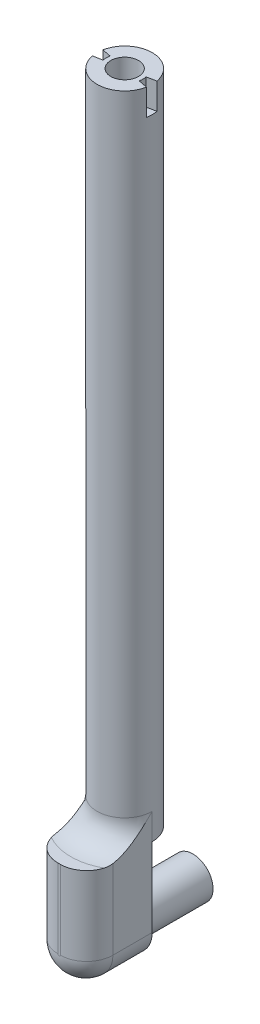
ISO-10303-21;
HEADER;
FILE_DESCRIPTION(('STEP AP214'),'2;1');
FILE_NAME('part.step','',(''),(''),'','','');
FILE_SCHEMA(('AUTOMOTIVE_DESIGN { 1 0 10303 214 1 1 1 1 }'));
ENDSEC;
DATA;
#1=APPLICATION_CONTEXT('core data for automotive mechanical design processes');
#2=APPLICATION_PROTOCOL_DEFINITION('international standard','automotive_design',2000,#1);
#3=PRODUCT_CONTEXT('',#1,'mechanical');
#4=PRODUCT('Part','Part','',(#3));
#5=PRODUCT_RELATED_PRODUCT_CATEGORY('part','',(#4));
#6=PRODUCT_DEFINITION_FORMATION('','',#4);
#7=PRODUCT_DEFINITION_CONTEXT('part definition',#1,'design');
#8=PRODUCT_DEFINITION('design','',#6,#7);
#9=PRODUCT_DEFINITION_SHAPE('','',#8);
#10=(LENGTH_UNIT() NAMED_UNIT(*) SI_UNIT(.MILLI.,.METRE.));
#11=(NAMED_UNIT(*) PLANE_ANGLE_UNIT() SI_UNIT($,.RADIAN.));
#12=(NAMED_UNIT(*) SI_UNIT($,.STERADIAN.) SOLID_ANGLE_UNIT());
#13=UNCERTAINTY_MEASURE_WITH_UNIT(LENGTH_MEASURE(1.E-05),#10,'distance_accuracy_value','');
#14=(GEOMETRIC_REPRESENTATION_CONTEXT(3) GLOBAL_UNCERTAINTY_ASSIGNED_CONTEXT((#13)) GLOBAL_UNIT_ASSIGNED_CONTEXT((#10,
#11,#12)) REPRESENTATION_CONTEXT('',''));
#15=CARTESIAN_POINT('',(0.,0.,0.));
#16=DIRECTION('',(0.,0.,1.));
#17=DIRECTION('',(1.,0.,0.));
#18=AXIS2_PLACEMENT_3D('',#15,#16,#17);
#19=CARTESIAN_POINT('',(0.,120.,0.));
#20=DIRECTION('',(0.,1.,0.));
#21=DIRECTION('',(0.,0.,1.));
#22=AXIS2_PLACEMENT_3D('',#19,#20,#21);
#23=PLANE('',#22);
#24=DIRECTION('',(-0.981691815623253,0.,0.19047619047619));
#25=VECTOR('',#24,1.);
#26=CARTESIAN_POINT('',(-3.43592135468138,120.,0.666666666666667));
#27=LINE('',#26,#25);
#28=CARTESIAN_POINT('',(-3.43592135468138,120.,0.666666666666667));
#29=VERTEX_POINT('',#28);
#30=CARTESIAN_POINT('',(-5.15388203202208,120.,1.));
#31=VERTEX_POINT('',#30);
#32=EDGE_CURVE('E63',#29,#31,#27,.T.);
#33=ORIENTED_EDGE('',*,*,#32,.F.);
#34=CARTESIAN_POINT('',(0.,120.,0.));
#35=DIRECTION('',(0.,1.,0.));
#36=DIRECTION('',(0.,0.,1.));
#37=AXIS2_PLACEMENT_3D('',#34,#35,#36);
#38=CIRCLE('',#37,3.5);
#39=CARTESIAN_POINT('',(-3.43592135468138,120.,-0.666666666666666));
#40=VERTEX_POINT('',#39);
#41=EDGE_CURVE('E67',#40,#29,#38,.T.);
#42=ORIENTED_EDGE('',*,*,#41,.F.);
#43=DIRECTION('',(0.981691815623253,0.,0.19047619047619));
#44=VECTOR('',#43,1.);
#45=CARTESIAN_POINT('',(-3.43592135468138,120.,-0.666666666666666));
#46=LINE('',#45,#44);
#47=CARTESIAN_POINT('',(-5.15388203202208,120.,-0.999999999999999));
#48=VERTEX_POINT('',#47);
#49=EDGE_CURVE('E591',#48,#40,#46,.T.);
#50=ORIENTED_EDGE('',*,*,#49,.F.);
#51=CARTESIAN_POINT('',(0.,120.,0.));
#52=DIRECTION('',(0.,1.,0.));
#53=DIRECTION('',(0.,0.,1.));
#54=AXIS2_PLACEMENT_3D('',#51,#52,#53);
#55=CIRCLE('',#54,5.25);
#56=EDGE_CURVE('E219',#48,#31,#55,.T.);
#57=ORIENTED_EDGE('',*,*,#56,.T.);
#58=EDGE_LOOP('',(#33,#42,#50,#57));
#59=FACE_BOUND('',#58,.T.);
#60=ADVANCED_FACE('F45',(#59),#23,.T.);
#61=CARTESIAN_POINT('',(0.,120.,0.));
#62=DIRECTION('',(0.,-1.,0.));
#63=DIRECTION('',(0.,0.,-1.));
#64=AXIS2_PLACEMENT_3D('',#61,#62,#63);
#65=CYLINDRICAL_SURFACE('',#64,5.25);
#66=CARTESIAN_POINT('',(5.15388203202208,120.,1.));
#67=VERTEX_POINT('',#66);
#68=CARTESIAN_POINT('',(5.15388203202208,120.,-1.));
#69=VERTEX_POINT('',#68);
#70=EDGE_CURVE('E216',#67,#69,#55,.T.);
#71=ORIENTED_EDGE('',*,*,#70,.F.);
#72=DIRECTION('',(0.,-1.,0.));
#73=VECTOR('',#72,1.);
#74=CARTESIAN_POINT('',(5.15388203202208,125.,0.999999999999999));
#75=LINE('',#74,#73);
#76=CARTESIAN_POINT('',(5.15388203202208,125.,0.999999999999999));
#77=VERTEX_POINT('',#76);
#78=EDGE_CURVE('E571',#77,#67,#75,.T.);
#79=ORIENTED_EDGE('',*,*,#78,.F.);
#80=CARTESIAN_POINT('',(0.,125.,0.));
#81=DIRECTION('',(0.,1.,0.));
#82=DIRECTION('',(0.,0.,1.));
#83=AXIS2_PLACEMENT_3D('',#80,#81,#82);
#84=CIRCLE('',#83,5.25000000000001);
#85=CARTESIAN_POINT('',(-5.15388203202208,125.,1.));
#86=VERTEX_POINT('',#85);
#87=EDGE_CURVE('E576',#86,#77,#84,.T.);
#88=ORIENTED_EDGE('',*,*,#87,.F.);
#89=DIRECTION('',(0.,-1.,0.));
#90=VECTOR('',#89,1.);
#91=CARTESIAN_POINT('',(-5.15388203202208,125.,1.));
#92=LINE('',#91,#90);
#93=EDGE_CURVE('E574',#86,#31,#92,.T.);
#94=ORIENTED_EDGE('',*,*,#93,.T.);
#95=ORIENTED_EDGE('',*,*,#56,.F.);
#96=DIRECTION('',(0.,-1.,0.));
#97=VECTOR('',#96,1.);
#98=CARTESIAN_POINT('',(-5.15388203202208,125.,-1.));
#99=LINE('',#98,#97);
#100=CARTESIAN_POINT('',(-5.15388203202208,125.,-1.));
#101=VERTEX_POINT('',#100);
#102=EDGE_CURVE('E189',#101,#48,#99,.T.);
#103=ORIENTED_EDGE('',*,*,#102,.F.);
#104=CARTESIAN_POINT('',(0.,125.,0.));
#105=DIRECTION('',(0.,1.,0.));
#106=DIRECTION('',(0.,0.,-1.));
#107=AXIS2_PLACEMENT_3D('',#104,#105,#106);
#108=CIRCLE('',#107,5.25);
#109=CARTESIAN_POINT('',(5.15388203202208,125.,-1.));
#110=VERTEX_POINT('',#109);
#111=EDGE_CURVE('E169',#110,#101,#108,.T.);
#112=ORIENTED_EDGE('',*,*,#111,.F.);
#113=DIRECTION('',(0.,-1.,0.));
#114=VECTOR('',#113,1.);
#115=CARTESIAN_POINT('',(5.15388203202208,125.,-1.));
#116=LINE('',#115,#114);
#117=EDGE_CURVE('E166',#110,#69,#116,.T.);
#118=ORIENTED_EDGE('',*,*,#117,.T.);
#119=EDGE_LOOP('',(#71,#79,#88,#94,#95,#103,#112,#118));
#120=FACE_BOUND('',#119,.T.);
#121=CARTESIAN_POINT('',(0.,5.,0.));
#122=DIRECTION('',(0.,-1.,0.));
#123=DIRECTION('',(0.,0.,-1.));
#124=AXIS2_PLACEMENT_3D('',#121,#122,#123);
#125=CIRCLE('',#124,5.25);
#126=CARTESIAN_POINT('',(-5.25,5.,0.));
#127=VERTEX_POINT('',#126);
#128=CARTESIAN_POINT('',(5.25,5.,0.));
#129=VERTEX_POINT('',#128);
#130=EDGE_CURVE('E227',#127,#129,#125,.F.);
#131=ORIENTED_EDGE('',*,*,#130,.T.);
#132=DIRECTION('',(0.,-1.,0.));
#133=VECTOR('',#132,1.);
#134=CARTESIAN_POINT('',(5.25,2.5,0.));
#135=LINE('',#134,#133);
#136=CARTESIAN_POINT('',(5.25,0.,0.));
#137=VERTEX_POINT('',#136);
#138=EDGE_CURVE('E230',#129,#137,#135,.T.);
#139=ORIENTED_EDGE('',*,*,#138,.T.);
#140=CARTESIAN_POINT('',(0.,0.,0.));
#141=DIRECTION('',(0.,1.,0.));
#142=DIRECTION('',(0.,0.,1.));
#143=AXIS2_PLACEMENT_3D('',#140,#141,#142);
#144=CIRCLE('',#143,5.25);
#145=CARTESIAN_POINT('',(-5.25,0.,0.));
#146=VERTEX_POINT('',#145);
#147=EDGE_CURVE('E215',#137,#146,#144,.T.);
#148=ORIENTED_EDGE('',*,*,#147,.T.);
#149=DIRECTION('',(0.,-1.,0.));
#150=VECTOR('',#149,1.);
#151=CARTESIAN_POINT('',(-5.25,2.5,0.));
#152=LINE('',#151,#150);
#153=EDGE_CURVE('E224',#146,#127,#152,.F.);
#154=ORIENTED_EDGE('',*,*,#153,.T.);
#155=EDGE_LOOP('',(#131,#139,#148,#154));
#156=FACE_BOUND('',#155,.T.);
#157=ADVANCED_FACE('F280',(#120,#156),#65,.T.);
#158=DIRECTION('',(-0.981691815623253,0.,-0.190476190476191));
#159=VECTOR('',#158,1.);
#160=CARTESIAN_POINT('',(3.43592135468138,120.,0.666666666666667));
#161=LINE('',#160,#159);
#162=CARTESIAN_POINT('',(3.43592135468138,120.,0.666666666666667));
#163=VERTEX_POINT('',#162);
#164=EDGE_CURVE('E180',#67,#163,#161,.T.);
#165=ORIENTED_EDGE('',*,*,#164,.F.);
#166=ORIENTED_EDGE('',*,*,#70,.T.);
#167=DIRECTION('',(0.981691815623253,0.,-0.190476190476191));
#168=VECTOR('',#167,1.);
#169=CARTESIAN_POINT('',(3.43592135468138,120.,-0.666666666666667));
#170=LINE('',#169,#168);
#171=CARTESIAN_POINT('',(3.43592135468138,120.,-0.666666666666667));
#172=VERTEX_POINT('',#171);
#173=EDGE_CURVE('E601',#172,#69,#170,.T.);
#174=ORIENTED_EDGE('',*,*,#173,.F.);
#175=CARTESIAN_POINT('',(0.,120.,0.));
#176=DIRECTION('',(0.,1.,0.));
#177=DIRECTION('',(0.,0.,1.));
#178=AXIS2_PLACEMENT_3D('',#175,#176,#177);
#179=CIRCLE('',#178,3.5);
#180=EDGE_CURVE('E183',#163,#172,#179,.T.);
#181=ORIENTED_EDGE('',*,*,#180,.F.);
#182=EDGE_LOOP('',(#165,#166,#174,#181));
#183=FACE_BOUND('',#182,.T.);
#184=ADVANCED_FACE('F277',(#183),#23,.T.);
#185=CARTESIAN_POINT('',(0.,0.,0.));
#186=DIRECTION('',(0.,1.,0.));
#187=DIRECTION('',(0.,0.,1.));
#188=AXIS2_PLACEMENT_3D('',#185,#186,#187);
#189=PLANE('',#188);
#190=ORIENTED_EDGE('',*,*,#147,.F.);
#191=DIRECTION('',(-1.,0.,0.));
#192=VECTOR('',#191,1.);
#193=CARTESIAN_POINT('',(-5.25,0.,0.));
#194=LINE('',#193,#192);
#195=EDGE_CURVE('E196',#137,#146,#194,.T.);
#196=ORIENTED_EDGE('',*,*,#195,.T.);
#197=EDGE_LOOP('',(#190,#196));
#198=FACE_BOUND('',#197,.T.);
#199=ADVANCED_FACE('F275',(#198),#189,.F.);
#200=CARTESIAN_POINT('',(-5.25,0.,12.5));
#201=DIRECTION('',(0.,-1.,0.));
#202=DIRECTION('',(0.,0.,-1.));
#203=AXIS2_PLACEMENT_3D('',#200,#201,#202);
#204=PLANE('',#203);
#205=DIRECTION('',(-1.,0.,0.));
#206=VECTOR('',#205,1.);
#207=CARTESIAN_POINT('',(-5.25,0.,12.5));
#208=LINE('',#207,#206);
#209=CARTESIAN_POINT('',(0.249999999999999,0.,12.5));
#210=VERTEX_POINT('',#209);
#211=CARTESIAN_POINT('',(-0.250000000000002,0.,12.5));
#212=VERTEX_POINT('',#211);
#213=EDGE_CURVE('E197',#210,#212,#208,.T.);
#214=ORIENTED_EDGE('',*,*,#213,.F.);
#215=CARTESIAN_POINT('',(0.25,0.,7.5));
#216=DIRECTION('',(0.,-1.,0.));
#217=DIRECTION('',(0.,0.,-1.));
#218=AXIS2_PLACEMENT_3D('',#215,#216,#217);
#219=CIRCLE('',#218,5.);
#220=CARTESIAN_POINT('',(5.04306415923547,0.,8.92356452802549));
#221=VERTEX_POINT('',#220);
#222=EDGE_CURVE('E323',#210,#221,#219,.F.);
#223=ORIENTED_EDGE('',*,*,#222,.T.);
#224=CARTESIAN_POINT('',(0.,0.,0.));
#225=DIRECTION('',(0.,-1.,0.));
#226=DIRECTION('',(0.,0.,-1.));
#227=AXIS2_PLACEMENT_3D('',#224,#225,#226);
#228=CIRCLE('',#227,10.25);
#229=CARTESIAN_POINT('',(-5.04306415923547,0.,8.92356452802549));
#230=VERTEX_POINT('',#229);
#231=EDGE_CURVE('E232',#221,#230,#228,.T.);
#232=ORIENTED_EDGE('',*,*,#231,.T.);
#233=CARTESIAN_POINT('',(-0.25,0.,7.5));
#234=DIRECTION('',(0.,-1.,0.));
#235=DIRECTION('',(0.,0.,-1.));
#236=AXIS2_PLACEMENT_3D('',#233,#234,#235);
#237=CIRCLE('',#236,5.);
#238=EDGE_CURVE('E321',#230,#212,#237,.F.);
#239=ORIENTED_EDGE('',*,*,#238,.T.);
#240=EDGE_LOOP('',(#214,#223,#232,#239));
#241=FACE_BOUND('',#240,.T.);
#242=ADVANCED_FACE('F271',(#241),#204,.F.);
#243=CARTESIAN_POINT('',(-5.25,0.,12.5));
#244=DIRECTION('',(1.,0.,0.));
#245=DIRECTION('',(0.,1.,0.));
#246=AXIS2_PLACEMENT_3D('',#243,#244,#245);
#247=PLANE('',#246);
#248=DIRECTION('',(0.,0.,-1.));
#249=VECTOR('',#248,1.);
#250=CARTESIAN_POINT('',(-5.25,-15.,12.5));
#251=LINE('',#250,#249);
#252=CARTESIAN_POINT('',(-5.25,-15.,7.5));
#253=VERTEX_POINT('',#252);
#254=CARTESIAN_POINT('',(-5.25,-15.,0.));
#255=VERTEX_POINT('',#254);
#256=EDGE_CURVE('E213',#253,#255,#251,.T.);
#257=ORIENTED_EDGE('',*,*,#256,.F.);
#258=DIRECTION('',(0.,-1.,0.));
#259=VECTOR('',#258,1.);
#260=CARTESIAN_POINT('',(-5.25,0.,7.5));
#261=LINE('',#260,#259);
#262=CARTESIAN_POINT('',(-5.25,0.121394400865588,7.5));
#263=VERTEX_POINT('',#262);
#264=EDGE_CURVE('E11',#253,#263,#261,.F.);
#265=ORIENTED_EDGE('',*,*,#264,.T.);
#266=CARTESIAN_POINT('',(-5.25,0.,8.8034084308295));
#267=CARTESIAN_POINT('',(-5.25,-2.66526480200665E-05,8.58937406472333));
#268=CARTESIAN_POINT('',(-5.25,0.0101332823978595,8.37546277830649));
#269=CARTESIAN_POINT('',(-5.25,0.049413772071476,7.94969101534003));
#270=CARTESIAN_POINT('',(-5.25,0.0785060740640797,7.73782795956947));
#271=CARTESIAN_POINT('',(-5.25,0.153800703969782,7.31978860799924));
#272=CARTESIAN_POINT('',(-5.25,0.199797384195186,7.11357471993746));
#273=CARTESIAN_POINT('',(-5.25,0.307501458279333,6.70522664815358));
#274=CARTESIAN_POINT('',(-5.25,0.369216335982846,6.50309445745198));
#275=CARTESIAN_POINT('',(-5.25,0.534998955875783,6.02218893307883));
#276=CARTESIAN_POINT('',(-5.25,0.646070886745866,5.74582099179151));
#277=CARTESIAN_POINT('',(-5.25,0.89232708206337,5.20409033620875));
#278=CARTESIAN_POINT('',(-5.25,1.02751939561316,4.93873133220145));
#279=CARTESIAN_POINT('',(-5.25,1.31874018417057,4.41809033282697));
#280=CARTESIAN_POINT('',(-5.25,1.47486731607501,4.16286395984221));
#281=CARTESIAN_POINT('',(-5.25,1.80374662088683,3.66328306459299));
#282=CARTESIAN_POINT('',(-5.25,1.97650639952119,3.41893359148569));
#283=CARTESIAN_POINT('',(-5.25,2.58107361485432,2.61177139700268));
#284=CARTESIAN_POINT('',(-5.24999999999999,3.0431717744943,2.07185961076429));
#285=CARTESIAN_POINT('',(-5.25000000000001,4.00012030114473,1.02475493593432));
#286=CARTESIAN_POINT('',(-5.25000000000004,4.49494074599499,0.517532970670272));
#287=CARTESIAN_POINT('',(-5.25,4.99325252203019,0.00691410944674662));
#288=CARTESIAN_POINT('',(-5.25,4.99662626088722,0.00345705586487804));
#289=CARTESIAN_POINT('',(-5.25,5.00000000000001,0.));
#290=B_SPLINE_CURVE_WITH_KNOTS('',3,(#266,#267,#268,#269,#270,#271,#272,#273,#274,#275,#276,
#277,#278,#279,#280,#281,#282,#283,#284,#285,#286,#287,#288,#289),.UNSPECIFIED.,.F.,.F.,(4,2,2,
2,2,2,2,2,2,2,2,4),(0.,0.641681918870992,1.28240844949907,1.91558525968311,2.54906410732797,
3.44119765509576,4.33362947139886,5.23042531584404,6.12763320997787,8.25548650599567,
10.3814202436563,10.3959116204023),.UNSPECIFIED.);
#291=EDGE_CURVE('E244',#263,#127,#290,.T.);
#292=ORIENTED_EDGE('',*,*,#291,.T.);
#293=ORIENTED_EDGE('',*,*,#153,.F.);
#294=DIRECTION('',(0.,-1.,0.));
#295=VECTOR('',#294,1.);
#296=CARTESIAN_POINT('',(-5.25,0.,0.));
#297=LINE('',#296,#295);
#298=EDGE_CURVE('E204',#146,#255,#297,.T.);
#299=ORIENTED_EDGE('',*,*,#298,.T.);
#300=EDGE_LOOP('',(#257,#265,#292,#293,#299));
#301=FACE_BOUND('',#300,.T.);
#302=ADVANCED_FACE('F266',(#301),#247,.F.);
#303=CARTESIAN_POINT('',(0.,-15.,12.5));
#304=DIRECTION('',(0.,0.,-1.));
#305=DIRECTION('',(-1.,0.,0.));
#306=AXIS2_PLACEMENT_3D('',#303,#304,#305);
#307=CYLINDRICAL_SURFACE('',#306,5.25);
#308=DIRECTION('',(0.,0.,-1.));
#309=VECTOR('',#308,1.);
#310=CARTESIAN_POINT('',(5.25,-15.,12.5));
#311=LINE('',#310,#309);
#312=CARTESIAN_POINT('',(5.25,-15.,7.5));
#313=VERTEX_POINT('',#312);
#314=CARTESIAN_POINT('',(5.25,-15.,0.));
#315=VERTEX_POINT('',#314);
#316=EDGE_CURVE('E200',#313,#315,#311,.T.);
#317=ORIENTED_EDGE('',*,*,#316,.F.);
#318=CARTESIAN_POINT('',(0.,-15.,7.5));
#319=DIRECTION('',(0.,0.,1.));
#320=DIRECTION('',(1.,0.,0.));
#321=AXIS2_PLACEMENT_3D('',#318,#319,#320);
#322=CIRCLE('',#321,5.25);
#323=EDGE_CURVE('E55',#313,#253,#322,.F.);
#324=ORIENTED_EDGE('',*,*,#323,.T.);
#325=ORIENTED_EDGE('',*,*,#256,.T.);
#326=CARTESIAN_POINT('',(0.,-15.,0.));
#327=DIRECTION('',(0.,0.,1.));
#328=DIRECTION('',(1.,0.,0.));
#329=AXIS2_PLACEMENT_3D('',#326,#327,#328);
#330=CIRCLE('',#329,5.25);
#331=EDGE_CURVE('E207',#255,#315,#330,.T.);
#332=ORIENTED_EDGE('',*,*,#331,.T.);
#333=EDGE_LOOP('',(#317,#324,#325,#332));
#334=FACE_BOUND('',#333,.T.);
#335=ADVANCED_FACE('F261',(#334),#307,.T.);
#336=CARTESIAN_POINT('',(5.25,-15.,12.5));
#337=DIRECTION('',(-1.,0.,0.));
#338=DIRECTION('',(0.,0.,1.));
#339=AXIS2_PLACEMENT_3D('',#336,#337,#338);
#340=PLANE('',#339);
#341=CARTESIAN_POINT('',(5.25,0.,8.8034084308295));
#342=CARTESIAN_POINT('',(5.25,-2.66526480200983E-05,8.58937406472336));
#343=CARTESIAN_POINT('',(5.25,0.0101332823978565,8.37546277830655));
#344=CARTESIAN_POINT('',(5.25,0.0494137720714619,7.94969101534015));
#345=CARTESIAN_POINT('',(5.25,0.0785060740640574,7.73782795956962));
#346=CARTESIAN_POINT('',(5.25,0.153800703969749,7.31978860799939));
#347=CARTESIAN_POINT('',(5.25,0.199797384195157,7.11357471993758));
#348=CARTESIAN_POINT('',(5.25,0.307501458279315,6.70522664815365));
#349=CARTESIAN_POINT('',(5.25,0.369216335982836,6.50309445745201));
#350=CARTESIAN_POINT('',(5.25,0.534998955875791,6.02218893307881));
#351=CARTESIAN_POINT('',(5.25,0.646070886745885,5.74582099179146));
#352=CARTESIAN_POINT('',(5.25,0.892327082063416,5.20409033620866));
#353=CARTESIAN_POINT('',(5.25,1.02751939561323,4.93873133220134));
#354=CARTESIAN_POINT('',(5.25,1.31874018417063,4.41809033282686));
#355=CARTESIAN_POINT('',(5.25,1.47486731607506,4.16286395984213));
#356=CARTESIAN_POINT('',(5.25,1.80374662088687,3.66328306459296));
#357=CARTESIAN_POINT('',(5.25,1.97650639952124,3.4189335914857));
#358=CARTESIAN_POINT('',(5.25,2.58107361485422,2.61177139700263));
#359=CARTESIAN_POINT('',(5.25,3.04317177449379,2.07185961076387));
#360=CARTESIAN_POINT('',(5.25,4.00012030114516,1.02475493593483));
#361=CARTESIAN_POINT('',(5.25,4.49494074599677,0.517532970672072));
#362=CARTESIAN_POINT('',(5.25,4.99325252203021,0.00691410944677982));
#363=CARTESIAN_POINT('',(5.25,4.99662626088723,0.00345705586489471));
#364=CARTESIAN_POINT('',(5.25,5.,0.));
#365=B_SPLINE_CURVE_WITH_KNOTS('',3,(#341,#342,#343,#344,#345,#346,#347,#348,#349,#350,#351,
#352,#353,#354,#355,#356,#357,#358,#359,#360,#361,#362,#363,#364),.UNSPECIFIED.,.F.,.F.,(4,2,2,
2,2,2,2,2,2,2,2,4),(0.,0.641681918870901,1.28240844949888,1.91558525968301,2.54906410732797,
3.44119765509584,4.33362947139901,5.2304253158441,6.12763320997787,8.25548650599558,
10.3814202436562,10.3959116204023),.UNSPECIFIED.);
#366=CARTESIAN_POINT('',(5.25,0.121394400865588,7.5));
#367=VERTEX_POINT('',#366);
#368=EDGE_CURVE('E235',#129,#367,#365,.F.);
#369=ORIENTED_EDGE('',*,*,#368,.T.);
#370=DIRECTION('',(0.,1.,0.));
#371=VECTOR('',#370,1.);
#372=CARTESIAN_POINT('',(5.25,-15.,7.5));
#373=LINE('',#372,#371);
#374=EDGE_CURVE('E336',#367,#313,#373,.F.);
#375=ORIENTED_EDGE('',*,*,#374,.T.);
#376=ORIENTED_EDGE('',*,*,#316,.T.);
#377=DIRECTION('',(0.,1.,0.));
#378=VECTOR('',#377,1.);
#379=CARTESIAN_POINT('',(5.25,-15.,0.));
#380=LINE('',#379,#378);
#381=EDGE_CURVE('E201',#315,#137,#380,.T.);
#382=ORIENTED_EDGE('',*,*,#381,.T.);
#383=ORIENTED_EDGE('',*,*,#138,.F.);
#384=EDGE_LOOP('',(#369,#375,#376,#382,#383));
#385=FACE_BOUND('',#384,.T.);
#386=ADVANCED_FACE('F255',(#385),#340,.F.);
#387=CARTESIAN_POINT('',(0.,-15.,12.5));
#388=DIRECTION('',(0.,0.,1.));
#389=DIRECTION('',(1.,0.,0.));
#390=AXIS2_PLACEMENT_3D('',#387,#388,#389);
#391=PLANE('',#390);
#392=CARTESIAN_POINT('',(0.,-15.,12.5));
#393=DIRECTION('',(0.,0.,1.));
#394=DIRECTION('',(1.,0.,0.));
#395=AXIS2_PLACEMENT_3D('',#392,#393,#394);
#396=CIRCLE('',#395,0.249999999999999);
#397=CARTESIAN_POINT('',(-0.249999999999999,-15.,12.5));
#398=VERTEX_POINT('',#397);
#399=CARTESIAN_POINT('',(0.249999999999999,-15.,12.5));
#400=VERTEX_POINT('',#399);
#401=EDGE_CURVE('E312',#398,#400,#396,.T.);
#402=ORIENTED_EDGE('',*,*,#401,.T.);
#403=DIRECTION('',(0.,1.,0.));
#404=VECTOR('',#403,1.);
#405=CARTESIAN_POINT('',(0.25,0.,12.5));
#406=LINE('',#405,#404);
#407=EDGE_CURVE('E316',#400,#210,#406,.T.);
#408=ORIENTED_EDGE('',*,*,#407,.T.);
#409=ORIENTED_EDGE('',*,*,#213,.T.);
#410=DIRECTION('',(0.,-1.,0.));
#411=VECTOR('',#410,1.);
#412=CARTESIAN_POINT('',(-0.249999999999999,-15.,12.5));
#413=LINE('',#412,#411);
#414=EDGE_CURVE('E311',#212,#398,#413,.T.);
#415=ORIENTED_EDGE('',*,*,#414,.T.);
#416=EDGE_LOOP('',(#402,#408,#409,#415));
#417=FACE_BOUND('',#416,.T.);
#418=ADVANCED_FACE('F260',(#417),#391,.T.);
#419=CARTESIAN_POINT('',(0.,-15.,0.));
#420=DIRECTION('',(0.,0.,1.));
#421=DIRECTION('',(1.,0.,0.));
#422=AXIS2_PLACEMENT_3D('',#419,#420,#421);
#423=PLANE('',#422);
#424=CARTESIAN_POINT('',(0.,-15.,0.));
#425=DIRECTION('',(0.,0.,1.));
#426=DIRECTION('',(1.,0.,0.));
#427=AXIS2_PLACEMENT_3D('',#424,#425,#426);
#428=CIRCLE('',#427,3.85);
#429=CARTESIAN_POINT('',(3.85,-15.,0.));
#430=VERTEX_POINT('',#429);
#431=EDGE_CURVE('E218',#430,#430,#428,.F.);
#432=ORIENTED_EDGE('',*,*,#431,.F.);
#433=EDGE_LOOP('',(#432));
#434=FACE_BOUND('',#433,.T.);
#435=ORIENTED_EDGE('',*,*,#195,.F.);
#436=ORIENTED_EDGE('',*,*,#381,.F.);
#437=ORIENTED_EDGE('',*,*,#331,.F.);
#438=ORIENTED_EDGE('',*,*,#298,.F.);
#439=EDGE_LOOP('',(#435,#436,#437,#438));
#440=FACE_BOUND('',#439,.T.);
#441=ADVANCED_FACE('F263',(#434,#440),#423,.F.);
#442=CARTESIAN_POINT('',(0.,-15.,-13.));
#443=DIRECTION('',(0.,0.,1.));
#444=DIRECTION('',(1.,0.,0.));
#445=AXIS2_PLACEMENT_3D('',#442,#443,#444);
#446=CYLINDRICAL_SURFACE('',#445,3.85);
#447=CARTESIAN_POINT('',(0.,-15.,-13.));
#448=DIRECTION('',(0.,0.,-1.));
#449=DIRECTION('',(-1.,0.,0.));
#450=AXIS2_PLACEMENT_3D('',#447,#448,#449);
#451=CIRCLE('',#450,3.85);
#452=CARTESIAN_POINT('',(3.85,-15.,-13.));
#453=VERTEX_POINT('',#452);
#454=EDGE_CURVE('E193',#453,#453,#451,.T.);
#455=CARTESIAN_POINT('',(3.85,-15.,-13.));
#456=CARTESIAN_POINT('',(3.85,-15.,-12.8645833333333));
#457=CARTESIAN_POINT('',(3.85,-15.,-12.7291666666667));
#458=CARTESIAN_POINT('',(3.85,-15.,-12.4583333333333));
#459=CARTESIAN_POINT('',(3.85,-15.,-12.3229166666667));
#460=CARTESIAN_POINT('',(3.85,-15.,-12.0520833333333));
#461=CARTESIAN_POINT('',(3.85,-15.,-11.9166666666667));
#462=CARTESIAN_POINT('',(3.85,-15.,-11.6458333333333));
#463=CARTESIAN_POINT('',(3.85,-15.,-11.5104166666667));
#464=CARTESIAN_POINT('',(3.85,-15.,-11.2395833333333));
#465=CARTESIAN_POINT('',(3.85,-15.,-11.1041666666667));
#466=CARTESIAN_POINT('',(3.85,-15.,-10.8333333333333));
#467=CARTESIAN_POINT('',(3.85,-15.,-10.6979166666667));
#468=CARTESIAN_POINT('',(3.85,-15.,-10.4270833333333));
#469=CARTESIAN_POINT('',(3.85,-15.,-10.2916666666667));
#470=CARTESIAN_POINT('',(3.85,-15.,-10.0208333333333));
#471=CARTESIAN_POINT('',(3.85,-15.,-9.88541666666667));
#472=CARTESIAN_POINT('',(3.85,-15.,-9.61458333333333));
#473=CARTESIAN_POINT('',(3.85,-15.,-9.47916666666667));
#474=CARTESIAN_POINT('',(3.85,-15.,-9.20833333333333));
#475=CARTESIAN_POINT('',(3.85,-15.,-9.07291666666667));
#476=CARTESIAN_POINT('',(3.85,-15.,-8.80208333333333));
#477=CARTESIAN_POINT('',(3.85,-15.,-8.66666666666667));
#478=CARTESIAN_POINT('',(3.85,-15.,-8.39583333333333));
#479=CARTESIAN_POINT('',(3.85,-15.,-8.26041666666667));
#480=CARTESIAN_POINT('',(3.85,-15.,-7.98958333333333));
#481=CARTESIAN_POINT('',(3.85,-15.,-7.85416666666667));
#482=CARTESIAN_POINT('',(3.85,-15.,-7.58333333333333));
#483=CARTESIAN_POINT('',(3.85,-15.,-7.44791666666667));
#484=CARTESIAN_POINT('',(3.85,-15.,-7.17708333333333));
#485=CARTESIAN_POINT('',(3.85,-15.,-7.04166666666667));
#486=CARTESIAN_POINT('',(3.85,-15.,-6.77083333333333));
#487=CARTESIAN_POINT('',(3.85,-15.,-6.63541666666667));
#488=CARTESIAN_POINT('',(3.85,-15.,-6.36458333333333));
#489=CARTESIAN_POINT('',(3.85,-15.,-6.22916666666667));
#490=CARTESIAN_POINT('',(3.85,-15.,-5.95833333333333));
#491=CARTESIAN_POINT('',(3.85,-15.,-5.82291666666667));
#492=CARTESIAN_POINT('',(3.85,-15.,-5.55208333333333));
#493=CARTESIAN_POINT('',(3.85,-15.,-5.41666666666667));
#494=CARTESIAN_POINT('',(3.85,-15.,-5.14583333333333));
#495=CARTESIAN_POINT('',(3.85,-15.,-5.01041666666667));
#496=CARTESIAN_POINT('',(3.85,-15.,-4.73958333333333));
#497=CARTESIAN_POINT('',(3.85,-15.,-4.60416666666667));
#498=CARTESIAN_POINT('',(3.85,-15.,-4.33333333333333));
#499=CARTESIAN_POINT('',(3.85,-15.,-4.19791666666667));
#500=CARTESIAN_POINT('',(3.85,-15.,-3.92708333333333));
#501=CARTESIAN_POINT('',(3.85,-15.,-3.79166666666667));
#502=CARTESIAN_POINT('',(3.85,-15.,-3.52083333333333));
#503=CARTESIAN_POINT('',(3.85,-15.,-3.38541666666667));
#504=CARTESIAN_POINT('',(3.85,-15.,-3.11458333333333));
#505=CARTESIAN_POINT('',(3.85,-15.,-2.97916666666667));
#506=CARTESIAN_POINT('',(3.85,-15.,-2.70833333333333));
#507=CARTESIAN_POINT('',(3.85,-15.,-2.57291666666667));
#508=CARTESIAN_POINT('',(3.85,-15.,-2.30208333333333));
#509=CARTESIAN_POINT('',(3.85,-15.,-2.16666666666667));
#510=CARTESIAN_POINT('',(3.85,-15.,-1.89583333333333));
#511=CARTESIAN_POINT('',(3.85,-15.,-1.76041666666667));
#512=CARTESIAN_POINT('',(3.85,-15.,-1.48958333333333));
#513=CARTESIAN_POINT('',(3.85,-15.,-1.35416666666667));
#514=CARTESIAN_POINT('',(3.85,-15.,-1.08333333333333));
#515=CARTESIAN_POINT('',(3.85,-15.,-0.947916666666667));
#516=CARTESIAN_POINT('',(3.85,-15.,-0.677083333333334));
#517=CARTESIAN_POINT('',(3.85,-15.,-0.541666666666667));
#518=CARTESIAN_POINT('',(3.85,-15.,-0.270833333333334));
#519=CARTESIAN_POINT('',(3.85,-15.,-0.135416666666667));
#520=CARTESIAN_POINT('',(3.85,-15.,0.));
#521=B_SPLINE_CURVE_WITH_KNOTS('',3,(#455,#456,#457,#458,#459,#460,#461,#462,#463,#464,#465,
#466,#467,#468,#469,#470,#471,#472,#473,#474,#475,#476,#477,#478,#479,#480,#481,#482,#483,#484,
#485,#486,#487,#488,#489,#490,#491,#492,#493,#494,#495,#496,#497,#498,#499,#500,#501,#502,#503,
#504,#505,#506,#507,#508,#509,#510,#511,#512,#513,#514,#515,#516,#517,#518,#519,#520),
.UNSPECIFIED.,.F.,.F.,(4,2,2,2,2,2,2,2,2,2,2,2,2,2,2,2,2,2,2,2,2,2,2,2,2,2,2,2,2,2,2,2,4),(0.,
0.406249999999999,0.812499999999999,1.21875,1.625,2.03125,2.4375,2.84375,3.25,3.65625,4.0625,
4.46875,4.875,5.28125,5.6875,6.09375,6.5,6.90625,7.3125,7.71875,8.125,8.53125,8.9375,9.34375,
9.75,10.15625,10.5625,10.96875,11.375,11.78125,12.1875,12.59375,13.),.UNSPECIFIED.);
#522=EDGE_CURVE('BSEAM362',#453,#430,#521,.T.);
#523=ORIENTED_EDGE('',*,*,#454,.F.);
#524=ORIENTED_EDGE('',*,*,#431,.T.);
#525=ORIENTED_EDGE('',*,*,#522,.T.);
#526=ORIENTED_EDGE('',*,*,#522,.F.);
#527=EDGE_LOOP('',(#523,#525,#524,#526));
#528=FACE_BOUND('',#527,.T.);
#529=ADVANCED_FACE('F362',(#528),#446,.T.);
#530=CARTESIAN_POINT('',(0.,-15.,-13.));
#531=DIRECTION('',(0.,0.,-1.));
#532=DIRECTION('',(-1.,0.,0.));
#533=AXIS2_PLACEMENT_3D('',#530,#531,#532);
#534=PLANE('',#533);
#535=ORIENTED_EDGE('',*,*,#454,.T.);
#536=EDGE_LOOP('',(#535));
#537=FACE_BOUND('',#536,.T.);
#538=ADVANCED_FACE('F367',(#537),#534,.T.);
#539=CARTESIAN_POINT('',(0.,5.,0.));
#540=DIRECTION('',(0.,-1.,0.));
#541=DIRECTION('',(0.,0.,-1.));
#542=AXIS2_PLACEMENT_3D('',#539,#540,#541);
#543=TOROIDAL_SURFACE('',#542,10.25,5.);
#544=ORIENTED_EDGE('',*,*,#231,.F.);
#545=CARTESIAN_POINT('',(5.04306415923547,0.,8.92356452802549));
#546=CARTESIAN_POINT('',(5.07762080631706,9.35802518385882E-07,8.80727839807752));
#547=CARTESIAN_POINT('',(5.10791606907633,0.00212962994952064,8.68970335913056));
#548=CARTESIAN_POINT('',(5.15967403210693,0.0112444558980338,8.45370164137141));
#549=CARTESIAN_POINT('',(5.18119866092156,0.0181955593336197,8.33528716055913));
#550=CARTESIAN_POINT('',(5.2156043269088,0.0375385952363856,8.09764361994236));
#551=CARTESIAN_POINT('',(5.22848593641354,0.0499301673512232,7.97841461460316));
#552=CARTESIAN_POINT('',(5.24572806942657,0.0808612574833585,7.73925988066306));
#553=CARTESIAN_POINT('',(5.25002621901933,0.0994446412255892,7.61933535819716));
#554=CARTESIAN_POINT('',(5.25,0.121394400865587,7.5));
#555=B_SPLINE_CURVE_WITH_KNOTS('',3,(#545,#546,#547,#548,#549,#550,#551,#552,#553,#554),
.UNSPECIFIED.,.F.,.F.,(4,2,2,2,4),(0.,0.363868928172683,0.725122134228034,1.08635141609371,
1.45019624810402),.UNSPECIFIED.);
#556=EDGE_CURVE('E300',#221,#367,#555,.T.);
#557=ORIENTED_EDGE('',*,*,#556,.T.);
#558=ORIENTED_EDGE('',*,*,#368,.F.);
#559=ORIENTED_EDGE('',*,*,#130,.F.);
#560=ORIENTED_EDGE('',*,*,#291,.F.);
#561=CARTESIAN_POINT('',(-5.25,0.121394400865588,7.5));
#562=CARTESIAN_POINT('',(-5.25002621901933,0.0994446412255895,7.61933535819716));
#563=CARTESIAN_POINT('',(-5.24572806942657,0.0808612574833584,7.73925988066306));
#564=CARTESIAN_POINT('',(-5.22848593641354,0.0499301673512229,7.97841461460316));
#565=CARTESIAN_POINT('',(-5.2156043269088,0.0375385952363853,8.09764361994236));
#566=CARTESIAN_POINT('',(-5.18119866092156,0.0181955593336194,8.33528716055913));
#567=CARTESIAN_POINT('',(-5.15967403210693,0.0112444558980335,8.45370164137141));
#568=CARTESIAN_POINT('',(-5.10791606907633,0.00212962994952133,8.68970335913056));
#569=CARTESIAN_POINT('',(-5.07762080631705,9.35802520104871E-07,8.80727839807752));
#570=CARTESIAN_POINT('',(-5.04306415923547,0.,8.92356452802549));
#571=B_SPLINE_CURVE_WITH_KNOTS('',3,(#561,#562,#563,#564,#565,#566,#567,#568,#569,#570),
.UNSPECIFIED.,.F.,.F.,(4,2,2,2,4),(0.,0.363844832010302,0.725074113875981,1.08632731993133,
1.45019624810402),.UNSPECIFIED.);
#572=EDGE_CURVE('E325',#263,#230,#571,.T.);
#573=ORIENTED_EDGE('',*,*,#572,.T.);
#574=EDGE_LOOP('',(#544,#557,#558,#559,#560,#573));
#575=FACE_BOUND('',#574,.T.);
#576=ADVANCED_FACE('F251',(#575),#543,.F.);
#577=CARTESIAN_POINT('',(-0.249999999999999,-15.,7.5));
#578=DIRECTION('',(0.,1.,0.));
#579=DIRECTION('',(-1.,0.,0.));
#580=AXIS2_PLACEMENT_3D('',#577,#578,#579);
#581=CYLINDRICAL_SURFACE('',#580,5.);
#582=ORIENTED_EDGE('',*,*,#572,.F.);
#583=ORIENTED_EDGE('',*,*,#264,.F.);
#584=CARTESIAN_POINT('',(-0.249999999999999,-15.,7.5));
#585=DIRECTION('',(0.,-1.,0.));
#586=DIRECTION('',(1.,0.,0.));
#587=AXIS2_PLACEMENT_3D('',#584,#585,#586);
#588=CIRCLE('',#587,5.);
#589=EDGE_CURVE('E50',#398,#253,#588,.T.);
#590=ORIENTED_EDGE('',*,*,#589,.F.);
#591=ORIENTED_EDGE('',*,*,#414,.F.);
#592=ORIENTED_EDGE('',*,*,#238,.F.);
#593=EDGE_LOOP('',(#582,#583,#590,#591,#592));
#594=FACE_BOUND('',#593,.T.);
#595=ADVANCED_FACE('F47',(#594),#581,.T.);
#596=CARTESIAN_POINT('',(0.,-15.,7.5));
#597=DIRECTION('',(0.,0.,1.));
#598=DIRECTION('',(1.,0.,0.));
#599=AXIS2_PLACEMENT_3D('',#596,#597,#598);
#600=DEGENERATE_TOROIDAL_SURFACE('',#599,0.249999999999999,5.,.T.);
#601=ORIENTED_EDGE('',*,*,#589,.T.);
#602=ORIENTED_EDGE('',*,*,#323,.F.);
#603=CARTESIAN_POINT('',(0.249999999999999,-15.,7.5));
#604=DIRECTION('',(0.,1.,0.));
#605=DIRECTION('',(0.,0.,1.));
#606=AXIS2_PLACEMENT_3D('',#603,#604,#605);
#607=CIRCLE('',#606,5.);
#608=EDGE_CURVE('E187',#400,#313,#607,.T.);
#609=ORIENTED_EDGE('',*,*,#608,.F.);
#610=ORIENTED_EDGE('',*,*,#401,.F.);
#611=EDGE_LOOP('',(#601,#602,#609,#610));
#612=FACE_BOUND('',#611,.T.);
#613=ADVANCED_FACE('F341',(#612),#600,.T.);
#614=CARTESIAN_POINT('',(0.25,-15.,7.5));
#615=DIRECTION('',(0.,-1.,0.));
#616=DIRECTION('',(0.,0.,-1.));
#617=AXIS2_PLACEMENT_3D('',#614,#615,#616);
#618=CYLINDRICAL_SURFACE('',#617,5.);
#619=ORIENTED_EDGE('',*,*,#608,.T.);
#620=ORIENTED_EDGE('',*,*,#374,.F.);
#621=ORIENTED_EDGE('',*,*,#556,.F.);
#622=ORIENTED_EDGE('',*,*,#222,.F.);
#623=ORIENTED_EDGE('',*,*,#407,.F.);
#624=EDGE_LOOP('',(#619,#620,#621,#622,#623));
#625=FACE_BOUND('',#624,.T.);
#626=ADVANCED_FACE('F338',(#625),#618,.T.);
#627=CARTESIAN_POINT('',(0.,125.,0.));
#628=DIRECTION('',(0.,1.,0.));
#629=DIRECTION('',(0.,0.,1.));
#630=AXIS2_PLACEMENT_3D('',#627,#628,#629);
#631=PLANE('',#630);
#632=CARTESIAN_POINT('',(0.,125.,0.));
#633=DIRECTION('',(0.,1.,0.));
#634=DIRECTION('',(0.,0.,1.));
#635=AXIS2_PLACEMENT_3D('',#632,#633,#634);
#636=CIRCLE('',#635,3.5);
#637=CARTESIAN_POINT('',(3.43592135468138,125.,0.666666666666667));
#638=VERTEX_POINT('',#637);
#639=CARTESIAN_POINT('',(3.43592135468138,125.,-0.666666666666667));
#640=VERTEX_POINT('',#639);
#641=EDGE_CURVE('E170',#638,#640,#636,.T.);
#642=ORIENTED_EDGE('',*,*,#641,.T.);
#643=DIRECTION('',(0.981691815623253,0.,-0.190476190476191));
#644=VECTOR('',#643,1.);
#645=CARTESIAN_POINT('',(3.43592135468138,125.,-0.666666666666667));
#646=LINE('',#645,#644);
#647=EDGE_CURVE('E158',#640,#110,#646,.T.);
#648=ORIENTED_EDGE('',*,*,#647,.T.);
#649=ORIENTED_EDGE('',*,*,#111,.T.);
#650=DIRECTION('',(0.981691815623253,0.,0.19047619047619));
#651=VECTOR('',#650,1.);
#652=CARTESIAN_POINT('',(-3.43592135468138,125.,-0.666666666666666));
#653=LINE('',#652,#651);
#654=CARTESIAN_POINT('',(-3.43592135468138,125.,-0.666666666666666));
#655=VERTEX_POINT('',#654);
#656=EDGE_CURVE('E592',#101,#655,#653,.T.);
#657=ORIENTED_EDGE('',*,*,#656,.T.);
#658=CARTESIAN_POINT('',(0.,125.,0.));
#659=DIRECTION('',(0.,1.,0.));
#660=DIRECTION('',(0.,0.,1.));
#661=AXIS2_PLACEMENT_3D('',#658,#659,#660);
#662=CIRCLE('',#661,3.5);
#663=CARTESIAN_POINT('',(-3.43592135468138,125.,0.666666666666667));
#664=VERTEX_POINT('',#663);
#665=EDGE_CURVE('E608',#655,#664,#662,.T.);
#666=ORIENTED_EDGE('',*,*,#665,.T.);
#667=DIRECTION('',(-0.981691815623253,0.,0.19047619047619));
#668=VECTOR('',#667,1.);
#669=CARTESIAN_POINT('',(-3.43592135468138,125.,0.666666666666667));
#670=LINE('',#669,#668);
#671=EDGE_CURVE('E606',#664,#86,#670,.T.);
#672=ORIENTED_EDGE('',*,*,#671,.T.);
#673=ORIENTED_EDGE('',*,*,#87,.T.);
#674=DIRECTION('',(-0.981691815623253,0.,-0.190476190476191));
#675=VECTOR('',#674,1.);
#676=CARTESIAN_POINT('',(3.43592135468138,125.,0.666666666666667));
#677=LINE('',#676,#675);
#678=EDGE_CURVE('E176',#77,#638,#677,.T.);
#679=ORIENTED_EDGE('',*,*,#678,.T.);
#680=EDGE_LOOP('',(#642,#648,#649,#657,#666,#672,#673,#679));
#681=FACE_BOUND('',#680,.T.);
#682=CARTESIAN_POINT('',(0.,125.,0.));
#683=DIRECTION('',(0.,1.,0.));
#684=DIRECTION('',(0.,0.,1.));
#685=AXIS2_PLACEMENT_3D('',#682,#683,#684);
#686=CIRCLE('',#685,2.65);
#687=CARTESIAN_POINT('',(0.,125.,2.65));
#688=VERTEX_POINT('',#687);
#689=EDGE_CURVE('E603',#688,#688,#686,.T.);
#690=ORIENTED_EDGE('',*,*,#689,.F.);
#691=EDGE_LOOP('',(#690));
#692=FACE_BOUND('',#691,.T.);
#693=ADVANCED_FACE('F173',(#681,#692),#631,.T.);
#694=CARTESIAN_POINT('',(0.,125.,0.));
#695=DIRECTION('',(0.,-1.,0.));
#696=DIRECTION('',(0.,0.,-1.));
#697=AXIS2_PLACEMENT_3D('',#694,#695,#696);
#698=CYLINDRICAL_SURFACE('',#697,3.5);
#699=ORIENTED_EDGE('',*,*,#180,.T.);
#700=DIRECTION('',(0.,-1.,0.));
#701=VECTOR('',#700,1.);
#702=CARTESIAN_POINT('',(3.43592135468138,125.,-0.666666666666667));
#703=LINE('',#702,#701);
#704=EDGE_CURVE('E163',#640,#172,#703,.T.);
#705=ORIENTED_EDGE('',*,*,#704,.F.);
#706=ORIENTED_EDGE('',*,*,#641,.F.);
#707=DIRECTION('',(0.,-1.,0.));
#708=VECTOR('',#707,1.);
#709=CARTESIAN_POINT('',(3.43592135468138,125.,0.666666666666667));
#710=LINE('',#709,#708);
#711=EDGE_CURVE('E570',#638,#163,#710,.T.);
#712=ORIENTED_EDGE('',*,*,#711,.T.);
#713=EDGE_LOOP('',(#699,#705,#706,#712));
#714=FACE_BOUND('',#713,.T.);
#715=ADVANCED_FACE('F182',(#714),#698,.T.);
#716=CARTESIAN_POINT('',(3.43592135468138,125.,-0.666666666666667));
#717=DIRECTION('',(-0.190476190476191,0.,-0.981691815623253));
#718=DIRECTION('',(-0.981691815623253,0.,0.190476190476191));
#719=AXIS2_PLACEMENT_3D('',#716,#717,#718);
#720=PLANE('',#719);
#721=ORIENTED_EDGE('',*,*,#173,.T.);
#722=ORIENTED_EDGE('',*,*,#117,.F.);
#723=ORIENTED_EDGE('',*,*,#647,.F.);
#724=ORIENTED_EDGE('',*,*,#704,.T.);
#725=EDGE_LOOP('',(#721,#722,#723,#724));
#726=FACE_BOUND('',#725,.T.);
#727=ADVANCED_FACE('F161',(#726),#720,.F.);
#728=CARTESIAN_POINT('',(-3.43592135468138,125.,-0.666666666666666));
#729=DIRECTION('',(0.19047619047619,0.,-0.981691815623253));
#730=DIRECTION('',(-0.981691815623253,0.,-0.19047619047619));
#731=AXIS2_PLACEMENT_3D('',#728,#729,#730);
#732=PLANE('',#731);
#733=ORIENTED_EDGE('',*,*,#49,.T.);
#734=DIRECTION('',(0.,-1.,0.));
#735=VECTOR('',#734,1.);
#736=CARTESIAN_POINT('',(-3.43592135468138,125.,-0.666666666666666));
#737=LINE('',#736,#735);
#738=EDGE_CURVE('E585',#655,#40,#737,.T.);
#739=ORIENTED_EDGE('',*,*,#738,.F.);
#740=ORIENTED_EDGE('',*,*,#656,.F.);
#741=ORIENTED_EDGE('',*,*,#102,.T.);
#742=EDGE_LOOP('',(#733,#739,#740,#741));
#743=FACE_BOUND('',#742,.T.);
#744=ADVANCED_FACE('F385',(#743),#732,.F.);
#745=CARTESIAN_POINT('',(0.,125.,0.));
#746=DIRECTION('',(0.,-1.,0.));
#747=DIRECTION('',(0.,0.,-1.));
#748=AXIS2_PLACEMENT_3D('',#745,#746,#747);
#749=CYLINDRICAL_SURFACE('',#748,3.5);
#750=ORIENTED_EDGE('',*,*,#41,.T.);
#751=DIRECTION('',(0.,-1.,0.));
#752=VECTOR('',#751,1.);
#753=CARTESIAN_POINT('',(-3.43592135468138,125.,0.666666666666667));
#754=LINE('',#753,#752);
#755=EDGE_CURVE('E582',#664,#29,#754,.T.);
#756=ORIENTED_EDGE('',*,*,#755,.F.);
#757=ORIENTED_EDGE('',*,*,#665,.F.);
#758=ORIENTED_EDGE('',*,*,#738,.T.);
#759=EDGE_LOOP('',(#750,#756,#757,#758));
#760=FACE_BOUND('',#759,.T.);
#761=ADVANCED_FACE('F388',(#760),#749,.T.);
#762=CARTESIAN_POINT('',(-3.43592135468138,125.,0.666666666666667));
#763=DIRECTION('',(0.19047619047619,0.,0.981691815623253));
#764=DIRECTION('',(0.981691815623253,0.,-0.19047619047619));
#765=AXIS2_PLACEMENT_3D('',#762,#763,#764);
#766=PLANE('',#765);
#767=ORIENTED_EDGE('',*,*,#32,.T.);
#768=ORIENTED_EDGE('',*,*,#93,.F.);
#769=ORIENTED_EDGE('',*,*,#671,.F.);
#770=ORIENTED_EDGE('',*,*,#755,.T.);
#771=EDGE_LOOP('',(#767,#768,#769,#770));
#772=FACE_BOUND('',#771,.T.);
#773=ADVANCED_FACE('F392',(#772),#766,.F.);
#774=CARTESIAN_POINT('',(3.43592135468138,125.,0.666666666666667));
#775=DIRECTION('',(-0.190476190476191,0.,0.981691815623253));
#776=DIRECTION('',(0.981691815623253,0.,0.190476190476191));
#777=AXIS2_PLACEMENT_3D('',#774,#775,#776);
#778=PLANE('',#777);
#779=ORIENTED_EDGE('',*,*,#164,.T.);
#780=ORIENTED_EDGE('',*,*,#711,.F.);
#781=ORIENTED_EDGE('',*,*,#678,.F.);
#782=ORIENTED_EDGE('',*,*,#78,.T.);
#783=EDGE_LOOP('',(#779,#780,#781,#782));
#784=FACE_BOUND('',#783,.T.);
#785=ADVANCED_FACE('F379',(#784),#778,.F.);
#786=CARTESIAN_POINT('',(0.,112.,0.));
#787=DIRECTION('',(0.,1.,0.));
#788=DIRECTION('',(0.,0.,1.));
#789=AXIS2_PLACEMENT_3D('',#786,#787,#788);
#790=PLANE('',#789);
#791=CARTESIAN_POINT('',(0.,112.,0.));
#792=DIRECTION('',(0.,1.,0.));
#793=DIRECTION('',(0.,0.,1.));
#794=AXIS2_PLACEMENT_3D('',#791,#792,#793);
#795=CIRCLE('',#794,2.65);
#796=CARTESIAN_POINT('',(0.,112.,2.65));
#797=VERTEX_POINT('',#796);
#798=EDGE_CURVE('E184',#797,#797,#795,.T.);
#799=ORIENTED_EDGE('',*,*,#798,.T.);
#800=EDGE_LOOP('',(#799));
#801=FACE_BOUND('',#800,.T.);
#802=ADVANCED_FACE('F375',(#801),#790,.T.);
#803=CARTESIAN_POINT('',(0.,112.,0.));
#804=DIRECTION('',(0.,1.,0.));
#805=DIRECTION('',(0.,0.,1.));
#806=AXIS2_PLACEMENT_3D('',#803,#804,#805);
#807=CYLINDRICAL_SURFACE('',#806,2.65);
#808=ORIENTED_EDGE('',*,*,#798,.F.);
#809=EDGE_LOOP('',(#808));
#810=FACE_BOUND('',#809,.T.);
#811=ORIENTED_EDGE('',*,*,#689,.T.);
#812=EDGE_LOOP('',(#811));
#813=FACE_BOUND('',#812,.T.);
#814=ADVANCED_FACE('F372',(#810,#813),#807,.F.);
#815=CLOSED_SHELL('',(#60,#157,#184,#199,#242,#302,#335,#386,#418,#441,#529,#538,#576,#595,#613,
#626,#693,#715,#727,#744,#761,#773,#785,#802,#814));
#816=MANIFOLD_SOLID_BREP('B2',#815);
#817=ADVANCED_BREP_SHAPE_REPRESENTATION('',(#18,#816),#14);
#818=SHAPE_DEFINITION_REPRESENTATION(#9,#817);
ENDSEC;
END-ISO-10303-21;
